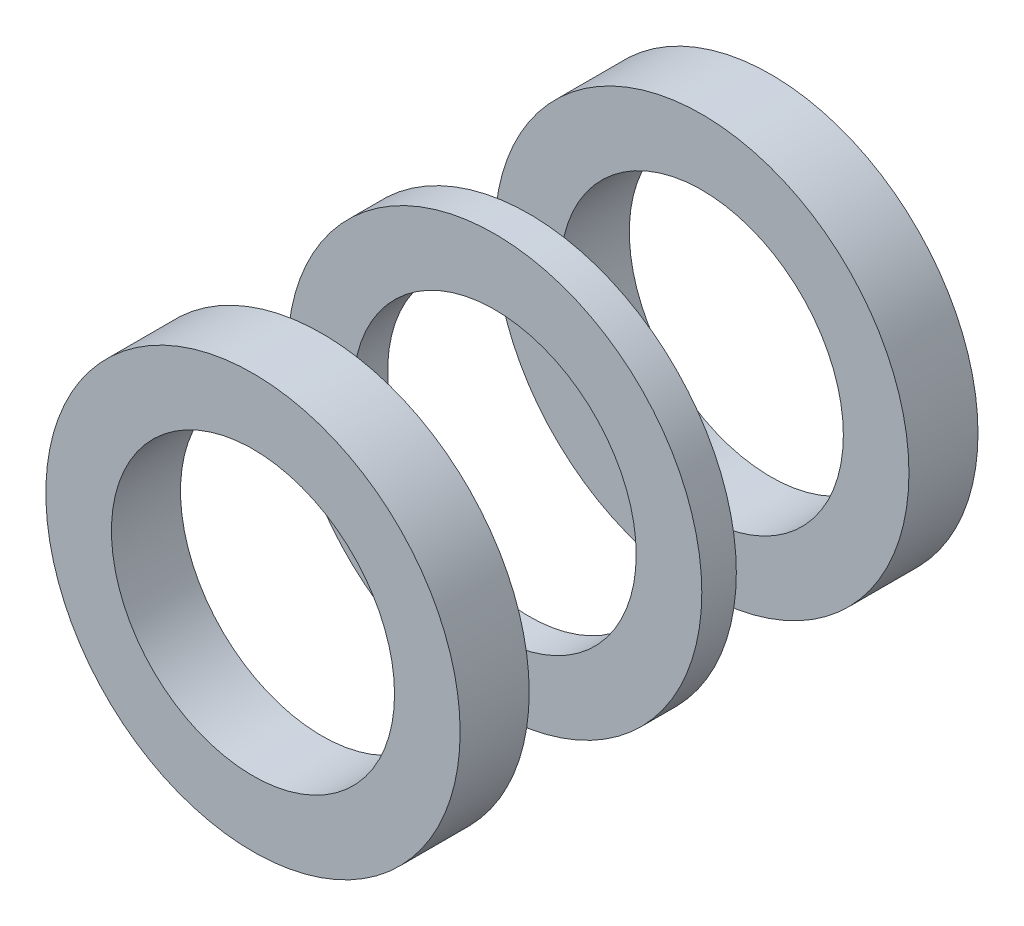
ISO-10303-21;
HEADER;
FILE_DESCRIPTION(('STEP AP214'),'2;1');
FILE_NAME('part.step','',(''),(''),'','','');
FILE_SCHEMA(('AUTOMOTIVE_DESIGN { 1 0 10303 214 1 1 1 1 }'));
ENDSEC;
DATA;
#1=APPLICATION_CONTEXT('core data for automotive mechanical design processes');
#2=APPLICATION_PROTOCOL_DEFINITION('international standard','automotive_design',2000,#1);
#3=PRODUCT_CONTEXT('',#1,'mechanical');
#4=PRODUCT('Part','Part','',(#3));
#5=PRODUCT_RELATED_PRODUCT_CATEGORY('part','',(#4));
#6=PRODUCT_DEFINITION_FORMATION('','',#4);
#7=PRODUCT_DEFINITION_CONTEXT('part definition',#1,'design');
#8=PRODUCT_DEFINITION('design','',#6,#7);
#9=PRODUCT_DEFINITION_SHAPE('','',#8);
#10=(LENGTH_UNIT() NAMED_UNIT(*) SI_UNIT(.MILLI.,.METRE.));
#11=(NAMED_UNIT(*) PLANE_ANGLE_UNIT() SI_UNIT($,.RADIAN.));
#12=(NAMED_UNIT(*) SI_UNIT($,.STERADIAN.) SOLID_ANGLE_UNIT());
#13=UNCERTAINTY_MEASURE_WITH_UNIT(LENGTH_MEASURE(1.E-05),#10,'distance_accuracy_value','');
#14=(GEOMETRIC_REPRESENTATION_CONTEXT(3) GLOBAL_UNCERTAINTY_ASSIGNED_CONTEXT((#13)) GLOBAL_UNIT_ASSIGNED_CONTEXT((#10,
#11,#12)) REPRESENTATION_CONTEXT('',''));
#15=CARTESIAN_POINT('',(0.,0.,0.));
#16=DIRECTION('',(0.,0.,1.));
#17=DIRECTION('',(1.,0.,0.));
#18=AXIS2_PLACEMENT_3D('',#15,#16,#17);
#19=CARTESIAN_POINT('',(0.,0.,44.5));
#20=DIRECTION('',(0.,0.,1.));
#21=DIRECTION('',(1.,0.,0.));
#22=AXIS2_PLACEMENT_3D('',#19,#20,#21);
#23=PLANE('',#22);
#24=CARTESIAN_POINT('',(0.,0.,44.5));
#25=DIRECTION('',(0.,0.,1.));
#26=DIRECTION('',(1.,0.,0.));
#27=AXIS2_PLACEMENT_3D('',#24,#25,#26);
#28=CIRCLE('',#27,6.);
#29=CARTESIAN_POINT('',(6.,0.,44.5));
#30=VERTEX_POINT('',#29);
#31=EDGE_CURVE('E11',#30,#30,#28,.T.);
#32=ORIENTED_EDGE('',*,*,#31,.T.);
#33=EDGE_LOOP('',(#32));
#34=FACE_BOUND('',#33,.T.);
#35=CARTESIAN_POINT('',(0.,0.,44.5));
#36=DIRECTION('',(0.,0.,1.));
#37=DIRECTION('',(1.,0.,0.));
#38=AXIS2_PLACEMENT_3D('',#35,#36,#37);
#39=CIRCLE('',#38,4.1);
#40=CARTESIAN_POINT('',(4.1,0.,44.5));
#41=VERTEX_POINT('',#40);
#42=EDGE_CURVE('E59',#41,#41,#39,.T.);
#43=ORIENTED_EDGE('',*,*,#42,.F.);
#44=EDGE_LOOP('',(#43));
#45=FACE_BOUND('',#44,.T.);
#46=ADVANCED_FACE('F45',(#34,#45),#23,.T.);
#47=CARTESIAN_POINT('',(0.,0.,42.5));
#48=DIRECTION('',(0.,0.,1.));
#49=DIRECTION('',(1.,0.,0.));
#50=AXIS2_PLACEMENT_3D('',#47,#48,#49);
#51=PLANE('',#50);
#52=CARTESIAN_POINT('',(0.,0.,42.5));
#53=DIRECTION('',(0.,0.,1.));
#54=DIRECTION('',(1.,0.,0.));
#55=AXIS2_PLACEMENT_3D('',#52,#53,#54);
#56=CIRCLE('',#55,6.);
#57=CARTESIAN_POINT('',(6.,0.,42.5));
#58=VERTEX_POINT('',#57);
#59=EDGE_CURVE('E49',#58,#58,#56,.T.);
#60=ORIENTED_EDGE('',*,*,#59,.F.);
#61=EDGE_LOOP('',(#60));
#62=FACE_BOUND('',#61,.T.);
#63=CARTESIAN_POINT('',(0.,0.,42.5));
#64=DIRECTION('',(0.,0.,1.));
#65=DIRECTION('',(1.,0.,0.));
#66=AXIS2_PLACEMENT_3D('',#63,#64,#65);
#67=CIRCLE('',#66,4.1);
#68=CARTESIAN_POINT('',(4.1,0.,42.5));
#69=VERTEX_POINT('',#68);
#70=EDGE_CURVE('E61',#69,#69,#67,.T.);
#71=ORIENTED_EDGE('',*,*,#70,.T.);
#72=EDGE_LOOP('',(#71));
#73=FACE_BOUND('',#72,.T.);
#74=ADVANCED_FACE('F72',(#62,#73),#51,.F.);
#75=CARTESIAN_POINT('',(0.,0.,44.5));
#76=DIRECTION('',(0.,0.,-1.));
#77=DIRECTION('',(-1.,0.,0.));
#78=AXIS2_PLACEMENT_3D('',#75,#76,#77);
#79=CYLINDRICAL_SURFACE('',#78,6.);
#80=ORIENTED_EDGE('',*,*,#31,.F.);
#81=EDGE_LOOP('',(#80));
#82=FACE_BOUND('',#81,.T.);
#83=ORIENTED_EDGE('',*,*,#59,.T.);
#84=EDGE_LOOP('',(#83));
#85=FACE_BOUND('',#84,.T.);
#86=ADVANCED_FACE('F47',(#82,#85),#79,.T.);
#87=CARTESIAN_POINT('',(0.,0.,44.5));
#88=DIRECTION('',(0.,0.,-1.));
#89=DIRECTION('',(-1.,0.,0.));
#90=AXIS2_PLACEMENT_3D('',#87,#88,#89);
#91=CYLINDRICAL_SURFACE('',#90,4.1);
#92=ORIENTED_EDGE('',*,*,#42,.T.);
#93=EDGE_LOOP('',(#92));
#94=FACE_BOUND('',#93,.T.);
#95=ORIENTED_EDGE('',*,*,#70,.F.);
#96=EDGE_LOOP('',(#95));
#97=FACE_BOUND('',#96,.T.);
#98=ADVANCED_FACE('F68',(#94,#97),#91,.F.);
#99=CLOSED_SHELL('',(#46,#74,#86,#98));
#100=MANIFOLD_SOLID_BREP('B2',#99);
#101=CARTESIAN_POINT('',(0.,0.,37.5));
#102=DIRECTION('',(0.,0.,1.));
#103=DIRECTION('',(1.,0.,0.));
#104=AXIS2_PLACEMENT_3D('',#101,#102,#103);
#105=PLANE('',#104);
#106=CARTESIAN_POINT('',(0.,0.,37.5));
#107=DIRECTION('',(0.,0.,1.));
#108=DIRECTION('',(1.,0.,0.));
#109=AXIS2_PLACEMENT_3D('',#106,#107,#108);
#110=CIRCLE('',#109,6.);
#111=CARTESIAN_POINT('',(6.,0.,37.5));
#112=VERTEX_POINT('',#111);
#113=EDGE_CURVE('E44',#112,#112,#110,.T.);
#114=ORIENTED_EDGE('',*,*,#113,.T.);
#115=EDGE_LOOP('',(#114));
#116=FACE_BOUND('',#115,.T.);
#117=CARTESIAN_POINT('',(0.,0.,37.5));
#118=DIRECTION('',(0.,0.,1.));
#119=DIRECTION('',(1.,0.,0.));
#120=AXIS2_PLACEMENT_3D('',#117,#118,#119);
#121=CIRCLE('',#120,4.1);
#122=CARTESIAN_POINT('',(4.1,0.,37.5));
#123=VERTEX_POINT('',#122);
#124=EDGE_CURVE('E135',#123,#123,#121,.T.);
#125=ORIENTED_EDGE('',*,*,#124,.F.);
#126=EDGE_LOOP('',(#125));
#127=FACE_BOUND('',#126,.T.);
#128=ADVANCED_FACE('F121',(#116,#127),#105,.T.);
#129=CARTESIAN_POINT('',(0.,0.,36.5));
#130=DIRECTION('',(0.,0.,1.));
#131=DIRECTION('',(1.,0.,0.));
#132=AXIS2_PLACEMENT_3D('',#129,#130,#131);
#133=PLANE('',#132);
#134=CARTESIAN_POINT('',(0.,0.,36.5));
#135=DIRECTION('',(0.,0.,1.));
#136=DIRECTION('',(1.,0.,0.));
#137=AXIS2_PLACEMENT_3D('',#134,#135,#136);
#138=CIRCLE('',#137,6.);
#139=CARTESIAN_POINT('',(6.,0.,36.5));
#140=VERTEX_POINT('',#139);
#141=EDGE_CURVE('E125',#140,#140,#138,.T.);
#142=ORIENTED_EDGE('',*,*,#141,.F.);
#143=EDGE_LOOP('',(#142));
#144=FACE_BOUND('',#143,.T.);
#145=CARTESIAN_POINT('',(0.,0.,36.5));
#146=DIRECTION('',(0.,0.,1.));
#147=DIRECTION('',(1.,0.,0.));
#148=AXIS2_PLACEMENT_3D('',#145,#146,#147);
#149=CIRCLE('',#148,4.1);
#150=CARTESIAN_POINT('',(4.1,0.,36.5));
#151=VERTEX_POINT('',#150);
#152=EDGE_CURVE('E137',#151,#151,#149,.T.);
#153=ORIENTED_EDGE('',*,*,#152,.T.);
#154=EDGE_LOOP('',(#153));
#155=FACE_BOUND('',#154,.T.);
#156=ADVANCED_FACE('F148',(#144,#155),#133,.F.);
#157=CARTESIAN_POINT('',(0.,0.,37.5));
#158=DIRECTION('',(0.,0.,-1.));
#159=DIRECTION('',(-1.,0.,0.));
#160=AXIS2_PLACEMENT_3D('',#157,#158,#159);
#161=CYLINDRICAL_SURFACE('',#160,6.);
#162=ORIENTED_EDGE('',*,*,#113,.F.);
#163=EDGE_LOOP('',(#162));
#164=FACE_BOUND('',#163,.T.);
#165=ORIENTED_EDGE('',*,*,#141,.T.);
#166=EDGE_LOOP('',(#165));
#167=FACE_BOUND('',#166,.T.);
#168=ADVANCED_FACE('F123',(#164,#167),#161,.T.);
#169=CARTESIAN_POINT('',(0.,0.,37.5));
#170=DIRECTION('',(0.,0.,-1.));
#171=DIRECTION('',(-1.,0.,0.));
#172=AXIS2_PLACEMENT_3D('',#169,#170,#171);
#173=CYLINDRICAL_SURFACE('',#172,4.1);
#174=ORIENTED_EDGE('',*,*,#124,.T.);
#175=EDGE_LOOP('',(#174));
#176=FACE_BOUND('',#175,.T.);
#177=ORIENTED_EDGE('',*,*,#152,.F.);
#178=EDGE_LOOP('',(#177));
#179=FACE_BOUND('',#178,.T.);
#180=ADVANCED_FACE('F144',(#176,#179),#173,.F.);
#181=CLOSED_SHELL('',(#128,#156,#168,#180));
#182=MANIFOLD_SOLID_BREP('B6',#181);
#183=CARTESIAN_POINT('',(0.,0.,31.5));
#184=DIRECTION('',(0.,0.,1.));
#185=DIRECTION('',(1.,0.,0.));
#186=AXIS2_PLACEMENT_3D('',#183,#184,#185);
#187=PLANE('',#186);
#188=CARTESIAN_POINT('',(0.,0.,31.5));
#189=DIRECTION('',(0.,0.,1.));
#190=DIRECTION('',(1.,0.,0.));
#191=AXIS2_PLACEMENT_3D('',#188,#189,#190);
#192=CIRCLE('',#191,6.);
#193=CARTESIAN_POINT('',(6.,0.,31.5));
#194=VERTEX_POINT('',#193);
#195=EDGE_CURVE('E120',#194,#194,#192,.T.);
#196=ORIENTED_EDGE('',*,*,#195,.T.);
#197=EDGE_LOOP('',(#196));
#198=FACE_BOUND('',#197,.T.);
#199=CARTESIAN_POINT('',(0.,0.,31.5));
#200=DIRECTION('',(0.,0.,1.));
#201=DIRECTION('',(1.,0.,0.));
#202=AXIS2_PLACEMENT_3D('',#199,#200,#201);
#203=CIRCLE('',#202,4.1);
#204=CARTESIAN_POINT('',(4.1,0.,31.5));
#205=VERTEX_POINT('',#204);
#206=EDGE_CURVE('E204',#205,#205,#203,.T.);
#207=ORIENTED_EDGE('',*,*,#206,.F.);
#208=EDGE_LOOP('',(#207));
#209=FACE_BOUND('',#208,.T.);
#210=ADVANCED_FACE('F190',(#198,#209),#187,.T.);
#211=CARTESIAN_POINT('',(0.,0.,29.5));
#212=DIRECTION('',(0.,0.,1.));
#213=DIRECTION('',(1.,0.,0.));
#214=AXIS2_PLACEMENT_3D('',#211,#212,#213);
#215=PLANE('',#214);
#216=CARTESIAN_POINT('',(0.,0.,29.5));
#217=DIRECTION('',(0.,0.,1.));
#218=DIRECTION('',(1.,0.,0.));
#219=AXIS2_PLACEMENT_3D('',#216,#217,#218);
#220=CIRCLE('',#219,6.);
#221=CARTESIAN_POINT('',(6.,0.,29.5));
#222=VERTEX_POINT('',#221);
#223=EDGE_CURVE('E194',#222,#222,#220,.T.);
#224=ORIENTED_EDGE('',*,*,#223,.F.);
#225=EDGE_LOOP('',(#224));
#226=FACE_BOUND('',#225,.T.);
#227=CARTESIAN_POINT('',(0.,0.,29.5));
#228=DIRECTION('',(0.,0.,1.));
#229=DIRECTION('',(1.,0.,0.));
#230=AXIS2_PLACEMENT_3D('',#227,#228,#229);
#231=CIRCLE('',#230,4.1);
#232=CARTESIAN_POINT('',(4.1,0.,29.5));
#233=VERTEX_POINT('',#232);
#234=EDGE_CURVE('E206',#233,#233,#231,.T.);
#235=ORIENTED_EDGE('',*,*,#234,.T.);
#236=EDGE_LOOP('',(#235));
#237=FACE_BOUND('',#236,.T.);
#238=ADVANCED_FACE('F217',(#226,#237),#215,.F.);
#239=CARTESIAN_POINT('',(0.,0.,31.5));
#240=DIRECTION('',(0.,0.,-1.));
#241=DIRECTION('',(-1.,0.,0.));
#242=AXIS2_PLACEMENT_3D('',#239,#240,#241);
#243=CYLINDRICAL_SURFACE('',#242,6.);
#244=ORIENTED_EDGE('',*,*,#195,.F.);
#245=EDGE_LOOP('',(#244));
#246=FACE_BOUND('',#245,.T.);
#247=ORIENTED_EDGE('',*,*,#223,.T.);
#248=EDGE_LOOP('',(#247));
#249=FACE_BOUND('',#248,.T.);
#250=ADVANCED_FACE('F192',(#246,#249),#243,.T.);
#251=CARTESIAN_POINT('',(0.,0.,31.5));
#252=DIRECTION('',(0.,0.,-1.));
#253=DIRECTION('',(-1.,0.,0.));
#254=AXIS2_PLACEMENT_3D('',#251,#252,#253);
#255=CYLINDRICAL_SURFACE('',#254,4.1);
#256=ORIENTED_EDGE('',*,*,#206,.T.);
#257=EDGE_LOOP('',(#256));
#258=FACE_BOUND('',#257,.T.);
#259=ORIENTED_EDGE('',*,*,#234,.F.);
#260=EDGE_LOOP('',(#259));
#261=FACE_BOUND('',#260,.T.);
#262=ADVANCED_FACE('F213',(#258,#261),#255,.F.);
#263=CLOSED_SHELL('',(#210,#238,#250,#262));
#264=MANIFOLD_SOLID_BREP('B39',#263);
#265=ADVANCED_BREP_SHAPE_REPRESENTATION('',(#18,#100,#182,#264),#14);
#266=SHAPE_DEFINITION_REPRESENTATION(#9,#265);
ENDSEC;
END-ISO-10303-21;
